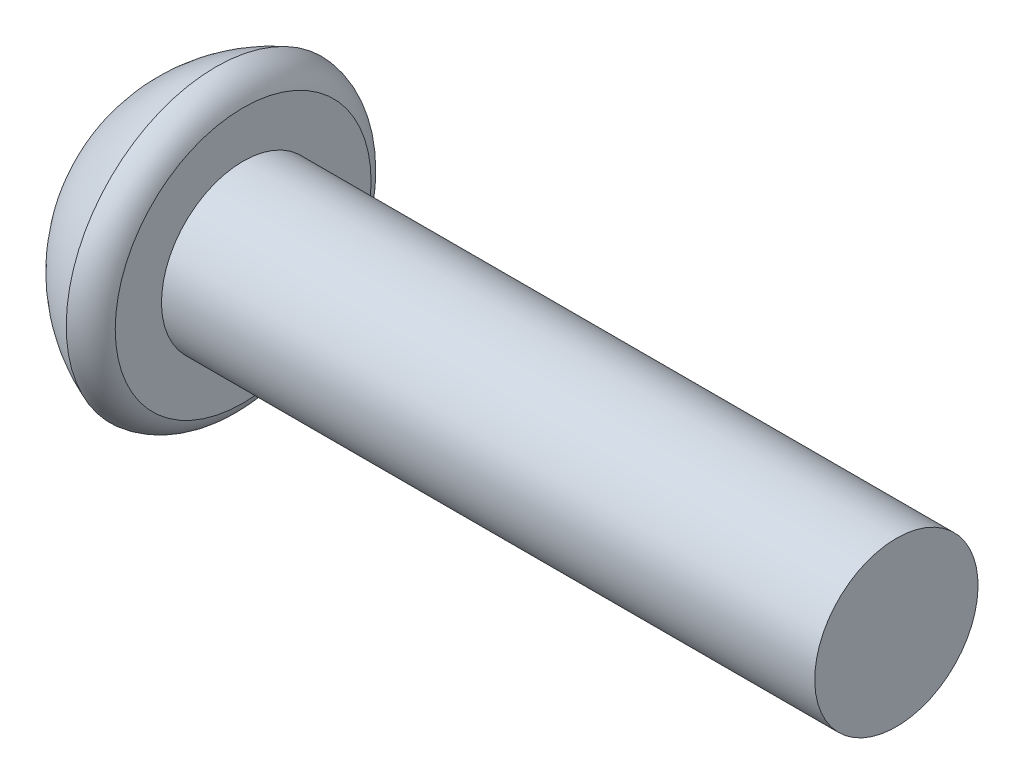
ISO-10303-21;
HEADER;
FILE_DESCRIPTION(('STEP AP214'),'2;1');
FILE_NAME('part.step','',(''),(''),'','','');
FILE_SCHEMA(('AUTOMOTIVE_DESIGN { 1 0 10303 214 1 1 1 1 }'));
ENDSEC;
DATA;
#1=APPLICATION_CONTEXT('core data for automotive mechanical design processes');
#2=APPLICATION_PROTOCOL_DEFINITION('international standard','automotive_design',2000,#1);
#3=PRODUCT_CONTEXT('',#1,'mechanical');
#4=PRODUCT('Part','Part','',(#3));
#5=PRODUCT_RELATED_PRODUCT_CATEGORY('part','',(#4));
#6=PRODUCT_DEFINITION_FORMATION('','',#4);
#7=PRODUCT_DEFINITION_CONTEXT('part definition',#1,'design');
#8=PRODUCT_DEFINITION('design','',#6,#7);
#9=PRODUCT_DEFINITION_SHAPE('','',#8);
#10=(LENGTH_UNIT() NAMED_UNIT(*) SI_UNIT(.MILLI.,.METRE.));
#11=(NAMED_UNIT(*) PLANE_ANGLE_UNIT() SI_UNIT($,.RADIAN.));
#12=(NAMED_UNIT(*) SI_UNIT($,.STERADIAN.) SOLID_ANGLE_UNIT());
#13=UNCERTAINTY_MEASURE_WITH_UNIT(LENGTH_MEASURE(1.E-05),#10,'distance_accuracy_value','');
#14=(GEOMETRIC_REPRESENTATION_CONTEXT(3) GLOBAL_UNCERTAINTY_ASSIGNED_CONTEXT((#13)) GLOBAL_UNIT_ASSIGNED_CONTEXT((#10,
#11,#12)) REPRESENTATION_CONTEXT('',''));
#15=CARTESIAN_POINT('',(0.,0.,0.));
#16=DIRECTION('',(0.,0.,1.));
#17=DIRECTION('',(1.,0.,0.));
#18=AXIS2_PLACEMENT_3D('',#15,#16,#17);
#19=CARTESIAN_POINT('',(0.,0.849999999999998,0.));
#20=DIRECTION('',(1.,0.,0.));
#21=DIRECTION('',(0.,1.,0.));
#22=AXIS2_PLACEMENT_3D('',#19,#20,#21);
#23=PLANE('',#22);
#24=CARTESIAN_POINT('',(0.,-1.5,0.));
#25=DIRECTION('',(1.,0.,0.));
#26=DIRECTION('',(0.,1.,0.));
#27=AXIS2_PLACEMENT_3D('',#24,#25,#26);
#28=CIRCLE('',#27,2.35);
#29=CARTESIAN_POINT('',(0.,0.849999999999998,0.));
#30=VERTEX_POINT('',#29);
#31=EDGE_CURVE('E157',#30,#30,#28,.T.);
#32=ORIENTED_EDGE('',*,*,#31,.T.);
#33=EDGE_LOOP('',(#32));
#34=FACE_BOUND('',#33,.T.);
#35=CARTESIAN_POINT('',(0.,-1.5,0.));
#36=DIRECTION('',(1.,0.,0.));
#37=DIRECTION('',(0.,1.,0.));
#38=AXIS2_PLACEMENT_3D('',#35,#36,#37);
#39=CIRCLE('',#38,1.5);
#40=CARTESIAN_POINT('',(0.,0.,0.));
#41=VERTEX_POINT('',#40);
#42=EDGE_CURVE('E11',#41,#41,#39,.T.);
#43=ORIENTED_EDGE('',*,*,#42,.F.);
#44=EDGE_LOOP('',(#43));
#45=FACE_BOUND('',#44,.T.);
#46=ADVANCED_FACE('F43',(#34,#45),#23,.T.);
#47=CARTESIAN_POINT('',(12.,-1.5,0.));
#48=DIRECTION('',(1.,0.,0.));
#49=DIRECTION('',(0.,1.,0.));
#50=AXIS2_PLACEMENT_3D('',#47,#48,#49);
#51=CYLINDRICAL_SURFACE('',#50,1.5);
#52=ORIENTED_EDGE('',*,*,#42,.T.);
#53=EDGE_LOOP('',(#52));
#54=FACE_BOUND('',#53,.T.);
#55=CARTESIAN_POINT('',(12.,-1.5,0.));
#56=DIRECTION('',(1.,0.,0.));
#57=DIRECTION('',(0.,1.,0.));
#58=AXIS2_PLACEMENT_3D('',#55,#56,#57);
#59=CIRCLE('',#58,1.5);
#60=CARTESIAN_POINT('',(12.,0.,0.));
#61=VERTEX_POINT('',#60);
#62=EDGE_CURVE('E51',#61,#61,#59,.T.);
#63=ORIENTED_EDGE('',*,*,#62,.F.);
#64=EDGE_LOOP('',(#63));
#65=FACE_BOUND('',#64,.T.);
#66=ADVANCED_FACE('F183',(#54,#65),#51,.T.);
#67=CARTESIAN_POINT('',(12.,0.,0.));
#68=DIRECTION('',(1.,0.,0.));
#69=DIRECTION('',(0.,1.,0.));
#70=AXIS2_PLACEMENT_3D('',#67,#68,#69);
#71=PLANE('',#70);
#72=ORIENTED_EDGE('',*,*,#62,.T.);
#73=EDGE_LOOP('',(#72));
#74=FACE_BOUND('',#73,.T.);
#75=ADVANCED_FACE('F181',(#74),#71,.T.);
#76=CARTESIAN_POINT('',(-2.,-1.5,0.));
#77=DIRECTION('',(-1.,0.,0.));
#78=DIRECTION('',(0.,-1.,0.));
#79=AXIS2_PLACEMENT_3D('',#76,#77,#78);
#80=PLANE('',#79);
#81=DIRECTION('',(0.,0.5,-0.866025403784438));
#82=VECTOR('',#81,1.);
#83=CARTESIAN_POINT('',(-2.,-0.864914703891413,1.1));
#84=LINE('',#83,#82);
#85=CARTESIAN_POINT('',(-2.,-0.864914703891413,1.1));
#86=VERTEX_POINT('',#85);
#87=CARTESIAN_POINT('',(-2.,-0.229829407782824,0.));
#88=VERTEX_POINT('',#87);
#89=EDGE_CURVE('E58',#86,#88,#84,.T.);
#90=ORIENTED_EDGE('',*,*,#89,.F.);
#91=DIRECTION('',(0.,1.,0.));
#92=VECTOR('',#91,1.);
#93=CARTESIAN_POINT('',(-2.,-2.13508529610859,1.1));
#94=LINE('',#93,#92);
#95=CARTESIAN_POINT('',(-2.,-2.13508529610859,1.1));
#96=VERTEX_POINT('',#95);
#97=EDGE_CURVE('E151',#96,#86,#94,.T.);
#98=ORIENTED_EDGE('',*,*,#97,.F.);
#99=DIRECTION('',(0.,0.5,0.866025403784439));
#100=VECTOR('',#99,1.);
#101=CARTESIAN_POINT('',(-2.,-2.77017059221718,0.));
#102=LINE('',#101,#100);
#103=CARTESIAN_POINT('',(-2.,-2.77017059221718,0.));
#104=VERTEX_POINT('',#103);
#105=EDGE_CURVE('E148',#104,#96,#102,.T.);
#106=ORIENTED_EDGE('',*,*,#105,.F.);
#107=DIRECTION('',(0.,-0.5,0.866025403784439));
#108=VECTOR('',#107,1.);
#109=CARTESIAN_POINT('',(-2.,-2.13508529610859,-1.1));
#110=LINE('',#109,#108);
#111=CARTESIAN_POINT('',(-2.,-2.13508529610859,-1.1));
#112=VERTEX_POINT('',#111);
#113=EDGE_CURVE('E106',#112,#104,#110,.T.);
#114=ORIENTED_EDGE('',*,*,#113,.F.);
#115=DIRECTION('',(0.,-1.,0.));
#116=VECTOR('',#115,1.);
#117=CARTESIAN_POINT('',(-2.,-0.864914703891413,-1.1));
#118=LINE('',#117,#116);
#119=CARTESIAN_POINT('',(-2.,-0.864914703891413,-1.1));
#120=VERTEX_POINT('',#119);
#121=EDGE_CURVE('E142',#120,#112,#118,.T.);
#122=ORIENTED_EDGE('',*,*,#121,.F.);
#123=DIRECTION('',(0.,-0.5,-0.866025403784439));
#124=VECTOR('',#123,1.);
#125=CARTESIAN_POINT('',(-2.,-0.229829407782824,0.));
#126=LINE('',#125,#124);
#127=EDGE_CURVE('E138',#88,#120,#126,.T.);
#128=ORIENTED_EDGE('',*,*,#127,.F.);
#129=EDGE_LOOP('',(#90,#98,#106,#114,#122,#128));
#130=FACE_BOUND('',#129,.T.);
#131=CARTESIAN_POINT('',(-2.,-1.5,0.));
#132=DIRECTION('',(1.,0.,0.));
#133=DIRECTION('',(0.,1.,0.));
#134=AXIS2_PLACEMENT_3D('',#131,#132,#133);
#135=CIRCLE('',#134,1.5);
#136=CARTESIAN_POINT('',(-2.,0.,0.));
#137=VERTEX_POINT('',#136);
#138=EDGE_CURVE('E174',#137,#137,#135,.T.);
#139=ORIENTED_EDGE('',*,*,#138,.F.);
#140=EDGE_LOOP('',(#139));
#141=FACE_BOUND('',#140,.T.);
#142=ADVANCED_FACE('F190',(#130,#141),#80,.T.);
#143=CARTESIAN_POINT('',(0.538908793687131,-1.5,0.));
#144=DIRECTION('',(1.,0.,0.));
#145=DIRECTION('',(0.,1.,0.));
#146=AXIS2_PLACEMENT_3D('',#143,#144,#145);
#147=DEGENERATE_TOROIDAL_SURFACE('',#146,0.021690552424558,2.96,.F.);
#148=ORIENTED_EDGE('',*,*,#138,.T.);
#149=EDGE_LOOP('',(#148));
#150=FACE_BOUND('',#149,.T.);
#151=CARTESIAN_POINT('',(-0.5,-1.5,0.));
#152=DIRECTION('',(1.,0.,0.));
#153=DIRECTION('',(0.,1.,0.));
#154=AXIS2_PLACEMENT_3D('',#151,#152,#153);
#155=CIRCLE('',#154,2.75);
#156=CARTESIAN_POINT('',(-0.500000000000001,1.25,0.));
#157=VERTEX_POINT('',#156);
#158=EDGE_CURVE('E170',#157,#157,#155,.T.);
#159=ORIENTED_EDGE('',*,*,#158,.F.);
#160=EDGE_LOOP('',(#159));
#161=FACE_BOUND('',#160,.T.);
#162=ADVANCED_FACE('F196',(#150,#161),#147,.F.);
#163=CARTESIAN_POINT('',(-0.566998114943999,-1.5,0.));
#164=DIRECTION('',(1.,0.,0.));
#165=DIRECTION('',(0.,1.,0.));
#166=AXIS2_PLACEMENT_3D('',#163,#164,#165);
#167=TOROIDAL_SURFACE('',#166,2.15375235632,0.6);
#168=ORIENTED_EDGE('',*,*,#158,.T.);
#169=EDGE_LOOP('',(#168));
#170=FACE_BOUND('',#169,.T.);
#171=ORIENTED_EDGE('',*,*,#31,.F.);
#172=EDGE_LOOP('',(#171));
#173=FACE_BOUND('',#172,.T.);
#174=ADVANCED_FACE('F200',(#170,#173),#167,.T.);
#175=CARTESIAN_POINT('',(-0.5,-0.864914703891413,1.1));
#176=DIRECTION('',(0.,0.866025403784439,0.5));
#177=DIRECTION('',(0.,-0.5,0.866025403784439));
#178=AXIS2_PLACEMENT_3D('',#175,#176,#177);
#179=PLANE('',#178);
#180=ORIENTED_EDGE('',*,*,#89,.T.);
#181=DIRECTION('',(-1.,0.,0.));
#182=VECTOR('',#181,1.);
#183=CARTESIAN_POINT('',(-0.5,-0.229829407782824,0.));
#184=LINE('',#183,#182);
#185=CARTESIAN_POINT('',(-0.5,-0.229829407782824,0.));
#186=VERTEX_POINT('',#185);
#187=EDGE_CURVE('E88',#186,#88,#184,.T.);
#188=ORIENTED_EDGE('',*,*,#187,.F.);
#189=DIRECTION('',(0.,0.5,-0.866025403784438));
#190=VECTOR('',#189,1.);
#191=CARTESIAN_POINT('',(-0.5,-0.864914703891413,1.1));
#192=LINE('',#191,#190);
#193=CARTESIAN_POINT('',(-0.5,-0.864914703891413,1.1));
#194=VERTEX_POINT('',#193);
#195=EDGE_CURVE('E154',#194,#186,#192,.T.);
#196=ORIENTED_EDGE('',*,*,#195,.F.);
#197=DIRECTION('',(-1.,0.,0.));
#198=VECTOR('',#197,1.);
#199=CARTESIAN_POINT('',(-0.5,-0.864914703891413,1.1));
#200=LINE('',#199,#198);
#201=EDGE_CURVE('E66',#194,#86,#200,.T.);
#202=ORIENTED_EDGE('',*,*,#201,.T.);
#203=EDGE_LOOP('',(#180,#188,#196,#202));
#204=FACE_BOUND('',#203,.T.);
#205=ADVANCED_FACE('F204',(#204),#179,.F.);
#206=CARTESIAN_POINT('',(-0.5,-2.13508529610859,1.1));
#207=DIRECTION('',(0.,0.,1.));
#208=DIRECTION('',(0.,-1.,0.));
#209=AXIS2_PLACEMENT_3D('',#206,#207,#208);
#210=PLANE('',#209);
#211=ORIENTED_EDGE('',*,*,#97,.T.);
#212=ORIENTED_EDGE('',*,*,#201,.F.);
#213=DIRECTION('',(0.,1.,0.));
#214=VECTOR('',#213,1.);
#215=CARTESIAN_POINT('',(-0.5,-2.13508529610859,1.1));
#216=LINE('',#215,#214);
#217=CARTESIAN_POINT('',(-0.5,-2.13508529610859,1.1));
#218=VERTEX_POINT('',#217);
#219=EDGE_CURVE('E120',#218,#194,#216,.T.);
#220=ORIENTED_EDGE('',*,*,#219,.F.);
#221=DIRECTION('',(-1.,0.,0.));
#222=VECTOR('',#221,1.);
#223=CARTESIAN_POINT('',(-0.5,-2.13508529610859,1.1));
#224=LINE('',#223,#222);
#225=EDGE_CURVE('E111',#218,#96,#224,.T.);
#226=ORIENTED_EDGE('',*,*,#225,.T.);
#227=EDGE_LOOP('',(#211,#212,#220,#226));
#228=FACE_BOUND('',#227,.T.);
#229=ADVANCED_FACE('F208',(#228),#210,.F.);
#230=CARTESIAN_POINT('',(-0.5,-2.77017059221718,0.));
#231=DIRECTION('',(0.,-0.866025403784439,0.5));
#232=DIRECTION('',(0.,-0.5,-0.866025403784439));
#233=AXIS2_PLACEMENT_3D('',#230,#231,#232);
#234=PLANE('',#233);
#235=ORIENTED_EDGE('',*,*,#105,.T.);
#236=ORIENTED_EDGE('',*,*,#225,.F.);
#237=DIRECTION('',(0.,0.5,0.866025403784439));
#238=VECTOR('',#237,1.);
#239=CARTESIAN_POINT('',(-0.5,-2.77017059221718,0.));
#240=LINE('',#239,#238);
#241=CARTESIAN_POINT('',(-0.5,-2.77017059221718,0.));
#242=VERTEX_POINT('',#241);
#243=EDGE_CURVE('E115',#242,#218,#240,.T.);
#244=ORIENTED_EDGE('',*,*,#243,.F.);
#245=DIRECTION('',(-1.,0.,0.));
#246=VECTOR('',#245,1.);
#247=CARTESIAN_POINT('',(-0.5,-2.77017059221718,0.));
#248=LINE('',#247,#246);
#249=EDGE_CURVE('E99',#242,#104,#248,.T.);
#250=ORIENTED_EDGE('',*,*,#249,.T.);
#251=EDGE_LOOP('',(#235,#236,#244,#250));
#252=FACE_BOUND('',#251,.T.);
#253=ADVANCED_FACE('F116',(#252),#234,.F.);
#254=CARTESIAN_POINT('',(-0.5,-2.13508529610859,-1.1));
#255=DIRECTION('',(0.,-0.866025403784439,-0.5));
#256=DIRECTION('',(0.,0.5,-0.866025403784439));
#257=AXIS2_PLACEMENT_3D('',#254,#255,#256);
#258=PLANE('',#257);
#259=ORIENTED_EDGE('',*,*,#113,.T.);
#260=ORIENTED_EDGE('',*,*,#249,.F.);
#261=DIRECTION('',(0.,-0.5,0.866025403784439));
#262=VECTOR('',#261,1.);
#263=CARTESIAN_POINT('',(-0.5,-2.13508529610859,-1.1));
#264=LINE('',#263,#262);
#265=CARTESIAN_POINT('',(-0.5,-2.13508529610859,-1.1));
#266=VERTEX_POINT('',#265);
#267=EDGE_CURVE('E103',#266,#242,#264,.T.);
#268=ORIENTED_EDGE('',*,*,#267,.F.);
#269=DIRECTION('',(-1.,0.,0.));
#270=VECTOR('',#269,1.);
#271=CARTESIAN_POINT('',(-0.5,-2.13508529610859,-1.1));
#272=LINE('',#271,#270);
#273=EDGE_CURVE('E112',#266,#112,#272,.T.);
#274=ORIENTED_EDGE('',*,*,#273,.T.);
#275=EDGE_LOOP('',(#259,#260,#268,#274));
#276=FACE_BOUND('',#275,.T.);
#277=ADVANCED_FACE('F101',(#276),#258,.F.);
#278=CARTESIAN_POINT('',(-0.5,-0.864914703891413,-1.1));
#279=DIRECTION('',(0.,0.,-1.));
#280=DIRECTION('',(0.,1.,0.));
#281=AXIS2_PLACEMENT_3D('',#278,#279,#280);
#282=PLANE('',#281);
#283=ORIENTED_EDGE('',*,*,#121,.T.);
#284=ORIENTED_EDGE('',*,*,#273,.F.);
#285=DIRECTION('',(0.,-1.,0.));
#286=VECTOR('',#285,1.);
#287=CARTESIAN_POINT('',(-0.5,-0.864914703891413,-1.1));
#288=LINE('',#287,#286);
#289=CARTESIAN_POINT('',(-0.5,-0.864914703891413,-1.1));
#290=VERTEX_POINT('',#289);
#291=EDGE_CURVE('E126',#290,#266,#288,.T.);
#292=ORIENTED_EDGE('',*,*,#291,.F.);
#293=DIRECTION('',(-1.,0.,0.));
#294=VECTOR('',#293,1.);
#295=CARTESIAN_POINT('',(-0.5,-0.864914703891413,-1.1));
#296=LINE('',#295,#294);
#297=EDGE_CURVE('E162',#290,#120,#296,.T.);
#298=ORIENTED_EDGE('',*,*,#297,.T.);
#299=EDGE_LOOP('',(#283,#284,#292,#298));
#300=FACE_BOUND('',#299,.T.);
#301=ADVANCED_FACE('F212',(#300),#282,.F.);
#302=CARTESIAN_POINT('',(-0.5,-0.229829407782824,0.));
#303=DIRECTION('',(0.,0.866025403784439,-0.5));
#304=DIRECTION('',(0.,0.5,0.866025403784439));
#305=AXIS2_PLACEMENT_3D('',#302,#303,#304);
#306=PLANE('',#305);
#307=ORIENTED_EDGE('',*,*,#127,.T.);
#308=ORIENTED_EDGE('',*,*,#297,.F.);
#309=DIRECTION('',(0.,-0.5,-0.866025403784439));
#310=VECTOR('',#309,1.);
#311=CARTESIAN_POINT('',(-0.5,-0.229829407782824,0.));
#312=LINE('',#311,#310);
#313=EDGE_CURVE('E130',#186,#290,#312,.T.);
#314=ORIENTED_EDGE('',*,*,#313,.F.);
#315=ORIENTED_EDGE('',*,*,#187,.T.);
#316=EDGE_LOOP('',(#307,#308,#314,#315));
#317=FACE_BOUND('',#316,.T.);
#318=ADVANCED_FACE('F209',(#317),#306,.F.);
#319=CARTESIAN_POINT('',(-0.5,0.,0.));
#320=DIRECTION('',(-1.,0.,0.));
#321=DIRECTION('',(0.,0.,1.));
#322=AXIS2_PLACEMENT_3D('',#319,#320,#321);
#323=PLANE('',#322);
#324=ORIENTED_EDGE('',*,*,#195,.T.);
#325=ORIENTED_EDGE('',*,*,#313,.T.);
#326=ORIENTED_EDGE('',*,*,#291,.T.);
#327=ORIENTED_EDGE('',*,*,#267,.T.);
#328=ORIENTED_EDGE('',*,*,#243,.T.);
#329=ORIENTED_EDGE('',*,*,#219,.T.);
#330=EDGE_LOOP('',(#324,#325,#326,#327,#328,#329));
#331=FACE_BOUND('',#330,.T.);
#332=ADVANCED_FACE('F123',(#331),#323,.T.);
#333=CLOSED_SHELL('',(#46,#66,#75,#142,#162,#174,#205,#229,#253,#277,#301,#318,#332));
#334=MANIFOLD_SOLID_BREP('B2',#333);
#335=ADVANCED_BREP_SHAPE_REPRESENTATION('',(#18,#334),#14);
#336=SHAPE_DEFINITION_REPRESENTATION(#9,#335);
ENDSEC;
END-ISO-10303-21;
